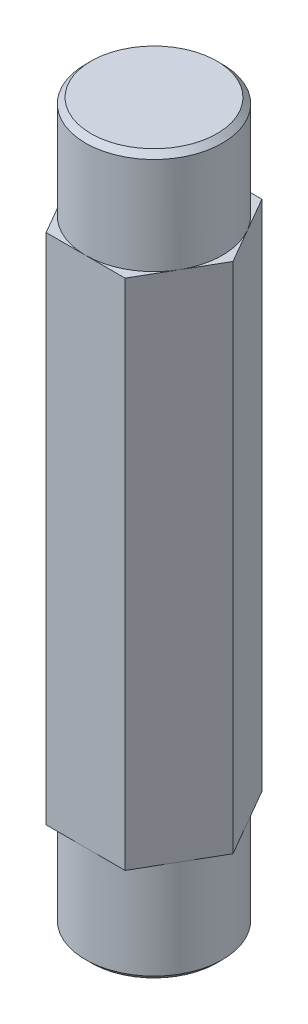
ISO-10303-21;
HEADER;
FILE_DESCRIPTION(('STEP AP214'),'2;1');
FILE_NAME('part.step','',(''),(''),'','','');
FILE_SCHEMA(('AUTOMOTIVE_DESIGN { 1 0 10303 214 1 1 1 1 }'));
ENDSEC;
DATA;
#1=APPLICATION_CONTEXT('core data for automotive mechanical design processes');
#2=APPLICATION_PROTOCOL_DEFINITION('international standard','automotive_design',2000,#1);
#3=PRODUCT_CONTEXT('',#1,'mechanical');
#4=PRODUCT('Part','Part','',(#3));
#5=PRODUCT_RELATED_PRODUCT_CATEGORY('part','',(#4));
#6=PRODUCT_DEFINITION_FORMATION('','',#4);
#7=PRODUCT_DEFINITION_CONTEXT('part definition',#1,'design');
#8=PRODUCT_DEFINITION('design','',#6,#7);
#9=PRODUCT_DEFINITION_SHAPE('','',#8);
#10=(LENGTH_UNIT() NAMED_UNIT(*) SI_UNIT(.MILLI.,.METRE.));
#11=(NAMED_UNIT(*) PLANE_ANGLE_UNIT() SI_UNIT($,.RADIAN.));
#12=(NAMED_UNIT(*) SI_UNIT($,.STERADIAN.) SOLID_ANGLE_UNIT());
#13=UNCERTAINTY_MEASURE_WITH_UNIT(LENGTH_MEASURE(1.E-05),#10,'distance_accuracy_value','');
#14=(GEOMETRIC_REPRESENTATION_CONTEXT(3) GLOBAL_UNCERTAINTY_ASSIGNED_CONTEXT((#13)) GLOBAL_UNIT_ASSIGNED_CONTEXT((#10,
#11,#12)) REPRESENTATION_CONTEXT('',''));
#15=CARTESIAN_POINT('',(0.,0.,0.));
#16=DIRECTION('',(0.,0.,1.));
#17=DIRECTION('',(1.,0.,0.));
#18=AXIS2_PLACEMENT_3D('',#15,#16,#17);
#19=CARTESIAN_POINT('',(0.,47.625,0.));
#20=DIRECTION('',(0.,1.,0.));
#21=DIRECTION('',(0.,0.,1.));
#22=AXIS2_PLACEMENT_3D('',#19,#20,#21);
#23=PLANE('',#22);
#24=CARTESIAN_POINT('',(0.,47.625,0.));
#25=DIRECTION('',(0.,1.,0.));
#26=DIRECTION('',(0.,0.,1.));
#27=AXIS2_PLACEMENT_3D('',#24,#25,#26);
#28=CIRCLE('',#27,6.35);
#29=CARTESIAN_POINT('',(0.,47.625,6.35));
#30=VERTEX_POINT('',#29);
#31=CARTESIAN_POINT('',(5.49926131403119,47.625,3.175));
#32=VERTEX_POINT('',#31);
#33=EDGE_CURVE('E146',#30,#32,#28,.T.);
#34=ORIENTED_EDGE('',*,*,#33,.F.);
#35=DIRECTION('',(1.,0.,0.));
#36=VECTOR('',#35,1.);
#37=CARTESIAN_POINT('',(-3.66617420935413,47.625,6.35));
#38=LINE('',#37,#36);
#39=CARTESIAN_POINT('',(3.66617420935412,47.625,6.35));
#40=VERTEX_POINT('',#39);
#41=EDGE_CURVE('E133',#30,#40,#38,.T.);
#42=ORIENTED_EDGE('',*,*,#41,.T.);
#43=DIRECTION('',(0.5,0.,-0.866025403784439));
#44=VECTOR('',#43,1.);
#45=CARTESIAN_POINT('',(3.66617420935412,47.625,6.35));
#46=LINE('',#45,#44);
#47=EDGE_CURVE('E147',#40,#32,#46,.T.);
#48=ORIENTED_EDGE('',*,*,#47,.T.);
#49=EDGE_LOOP('',(#34,#42,#48));
#50=FACE_BOUND('',#49,.T.);
#51=ADVANCED_FACE('F37',(#50),#23,.T.);
#52=CARTESIAN_POINT('',(5.49926131403119,47.625,-3.175));
#53=VERTEX_POINT('',#52);
#54=EDGE_CURVE('E152',#32,#53,#28,.T.);
#55=ORIENTED_EDGE('',*,*,#54,.F.);
#56=CARTESIAN_POINT('',(7.33234841870825,47.625,0.));
#57=VERTEX_POINT('',#56);
#58=EDGE_CURVE('E132',#32,#57,#46,.T.);
#59=ORIENTED_EDGE('',*,*,#58,.T.);
#60=DIRECTION('',(-0.5,0.,-0.866025403784439));
#61=VECTOR('',#60,1.);
#62=CARTESIAN_POINT('',(7.33234841870825,47.625,0.));
#63=LINE('',#62,#61);
#64=EDGE_CURVE('E166',#57,#53,#63,.T.);
#65=ORIENTED_EDGE('',*,*,#64,.T.);
#66=EDGE_LOOP('',(#55,#59,#65));
#67=FACE_BOUND('',#66,.T.);
#68=ADVANCED_FACE('F234',(#67),#23,.T.);
#69=CARTESIAN_POINT('',(0.,47.625,-6.35));
#70=VERTEX_POINT('',#69);
#71=EDGE_CURVE('E275',#53,#70,#28,.T.);
#72=ORIENTED_EDGE('',*,*,#71,.F.);
#73=CARTESIAN_POINT('',(3.66617420935413,47.625,-6.35));
#74=VERTEX_POINT('',#73);
#75=EDGE_CURVE('E165',#53,#74,#63,.T.);
#76=ORIENTED_EDGE('',*,*,#75,.T.);
#77=DIRECTION('',(-1.,0.,0.));
#78=VECTOR('',#77,1.);
#79=CARTESIAN_POINT('',(3.66617420935413,47.625,-6.35));
#80=LINE('',#79,#78);
#81=EDGE_CURVE('E170',#74,#70,#80,.T.);
#82=ORIENTED_EDGE('',*,*,#81,.T.);
#83=EDGE_LOOP('',(#72,#76,#82));
#84=FACE_BOUND('',#83,.T.);
#85=ADVANCED_FACE('F239',(#84),#23,.T.);
#86=CARTESIAN_POINT('',(-5.49926131403119,47.625,-3.175));
#87=VERTEX_POINT('',#86);
#88=EDGE_CURVE('E156',#70,#87,#28,.T.);
#89=ORIENTED_EDGE('',*,*,#88,.F.);
#90=CARTESIAN_POINT('',(-3.66617420935412,47.625,-6.35));
#91=VERTEX_POINT('',#90);
#92=EDGE_CURVE('E169',#70,#91,#80,.T.);
#93=ORIENTED_EDGE('',*,*,#92,.T.);
#94=DIRECTION('',(-0.5,0.,0.866025403784439));
#95=VECTOR('',#94,1.);
#96=CARTESIAN_POINT('',(-3.66617420935412,47.625,-6.35));
#97=LINE('',#96,#95);
#98=EDGE_CURVE('E174',#91,#87,#97,.T.);
#99=ORIENTED_EDGE('',*,*,#98,.T.);
#100=EDGE_LOOP('',(#89,#93,#99));
#101=FACE_BOUND('',#100,.T.);
#102=ADVANCED_FACE('F259',(#101),#23,.T.);
#103=CARTESIAN_POINT('',(-5.49926131403119,47.625,3.175));
#104=VERTEX_POINT('',#103);
#105=EDGE_CURVE('E60',#87,#104,#28,.T.);
#106=ORIENTED_EDGE('',*,*,#105,.F.);
#107=CARTESIAN_POINT('',(-7.33234841870825,47.625,0.));
#108=VERTEX_POINT('',#107);
#109=EDGE_CURVE('E173',#87,#108,#97,.T.);
#110=ORIENTED_EDGE('',*,*,#109,.T.);
#111=DIRECTION('',(0.5,0.,0.866025403784439));
#112=VECTOR('',#111,1.);
#113=CARTESIAN_POINT('',(-7.33234841870825,47.625,0.));
#114=LINE('',#113,#112);
#115=EDGE_CURVE('E177',#108,#104,#114,.T.);
#116=ORIENTED_EDGE('',*,*,#115,.T.);
#117=EDGE_LOOP('',(#106,#110,#116));
#118=FACE_BOUND('',#117,.T.);
#119=ADVANCED_FACE('F246',(#118),#23,.T.);
#120=CARTESIAN_POINT('',(0.,0.,0.));
#121=DIRECTION('',(0.,1.,0.));
#122=DIRECTION('',(0.,0.,1.));
#123=AXIS2_PLACEMENT_3D('',#120,#121,#122);
#124=PLANE('',#123);
#125=CARTESIAN_POINT('',(0.,0.,0.));
#126=DIRECTION('',(0.,-1.,0.));
#127=DIRECTION('',(0.,0.,-1.));
#128=AXIS2_PLACEMENT_3D('',#125,#126,#127);
#129=CIRCLE('',#128,6.35);
#130=CARTESIAN_POINT('',(0.,0.,-6.35));
#131=VERTEX_POINT('',#130);
#132=CARTESIAN_POINT('',(5.49926131403119,0.,-3.175));
#133=VERTEX_POINT('',#132);
#134=EDGE_CURVE('E150',#131,#133,#129,.T.);
#135=ORIENTED_EDGE('',*,*,#134,.F.);
#136=DIRECTION('',(-1.,0.,0.));
#137=VECTOR('',#136,1.);
#138=CARTESIAN_POINT('',(3.66617420935413,0.,-6.35));
#139=LINE('',#138,#137);
#140=CARTESIAN_POINT('',(3.66617420935413,0.,-6.35));
#141=VERTEX_POINT('',#140);
#142=EDGE_CURVE('E191',#141,#131,#139,.T.);
#143=ORIENTED_EDGE('',*,*,#142,.F.);
#144=DIRECTION('',(-0.5,0.,-0.866025403784439));
#145=VECTOR('',#144,1.);
#146=CARTESIAN_POINT('',(7.33234841870825,0.,0.));
#147=LINE('',#146,#145);
#148=EDGE_CURVE('E186',#133,#141,#147,.T.);
#149=ORIENTED_EDGE('',*,*,#148,.F.);
#150=EDGE_LOOP('',(#135,#143,#149));
#151=FACE_BOUND('',#150,.T.);
#152=ADVANCED_FACE('F253',(#151),#124,.F.);
#153=CARTESIAN_POINT('',(5.49926131403119,0.,3.175));
#154=VERTEX_POINT('',#153);
#155=EDGE_CURVE('E155',#133,#154,#129,.T.);
#156=ORIENTED_EDGE('',*,*,#155,.F.);
#157=CARTESIAN_POINT('',(7.33234841870825,0.,0.));
#158=VERTEX_POINT('',#157);
#159=EDGE_CURVE('E187',#158,#133,#147,.T.);
#160=ORIENTED_EDGE('',*,*,#159,.F.);
#161=DIRECTION('',(0.5,0.,-0.866025403784439));
#162=VECTOR('',#161,1.);
#163=CARTESIAN_POINT('',(3.66617420935412,0.,6.35));
#164=LINE('',#163,#162);
#165=EDGE_CURVE('E182',#154,#158,#164,.T.);
#166=ORIENTED_EDGE('',*,*,#165,.F.);
#167=EDGE_LOOP('',(#156,#160,#166));
#168=FACE_BOUND('',#167,.T.);
#169=ADVANCED_FACE('F264',(#168),#124,.F.);
#170=CARTESIAN_POINT('',(0.,0.,6.35));
#171=VERTEX_POINT('',#170);
#172=EDGE_CURVE('E158',#154,#171,#129,.T.);
#173=ORIENTED_EDGE('',*,*,#172,.F.);
#174=CARTESIAN_POINT('',(3.66617420935412,0.,6.35));
#175=VERTEX_POINT('',#174);
#176=EDGE_CURVE('E183',#175,#154,#164,.T.);
#177=ORIENTED_EDGE('',*,*,#176,.F.);
#178=DIRECTION('',(1.,0.,0.));
#179=VECTOR('',#178,1.);
#180=CARTESIAN_POINT('',(-3.66617420935413,0.,6.35));
#181=LINE('',#180,#179);
#182=EDGE_CURVE('E161',#171,#175,#181,.T.);
#183=ORIENTED_EDGE('',*,*,#182,.F.);
#184=EDGE_LOOP('',(#173,#177,#183));
#185=FACE_BOUND('',#184,.T.);
#186=ADVANCED_FACE('F306',(#185),#124,.F.);
#187=CARTESIAN_POINT('',(-5.49926131403119,0.,3.175));
#188=VERTEX_POINT('',#187);
#189=EDGE_CURVE('E301',#171,#188,#129,.T.);
#190=ORIENTED_EDGE('',*,*,#189,.F.);
#191=CARTESIAN_POINT('',(-3.66617420935413,0.,6.35));
#192=VERTEX_POINT('',#191);
#193=EDGE_CURVE('E180',#192,#171,#181,.T.);
#194=ORIENTED_EDGE('',*,*,#193,.F.);
#195=DIRECTION('',(0.5,0.,0.866025403784439));
#196=VECTOR('',#195,1.);
#197=CARTESIAN_POINT('',(-7.33234841870825,0.,0.));
#198=LINE('',#197,#196);
#199=EDGE_CURVE('E197',#188,#192,#198,.T.);
#200=ORIENTED_EDGE('',*,*,#199,.F.);
#201=EDGE_LOOP('',(#190,#194,#200));
#202=FACE_BOUND('',#201,.T.);
#203=ADVANCED_FACE('F312',(#202),#124,.F.);
#204=CARTESIAN_POINT('',(-5.49926131403119,0.,-3.175));
#205=VERTEX_POINT('',#204);
#206=EDGE_CURVE('E298',#188,#205,#129,.T.);
#207=ORIENTED_EDGE('',*,*,#206,.F.);
#208=CARTESIAN_POINT('',(-7.33234841870825,0.,0.));
#209=VERTEX_POINT('',#208);
#210=EDGE_CURVE('E144',#209,#188,#198,.T.);
#211=ORIENTED_EDGE('',*,*,#210,.F.);
#212=DIRECTION('',(-0.5,0.,0.866025403784439));
#213=VECTOR('',#212,1.);
#214=CARTESIAN_POINT('',(-3.66617420935412,0.,-6.35));
#215=LINE('',#214,#213);
#216=EDGE_CURVE('E193',#205,#209,#215,.T.);
#217=ORIENTED_EDGE('',*,*,#216,.F.);
#218=EDGE_LOOP('',(#207,#211,#217));
#219=FACE_BOUND('',#218,.T.);
#220=ADVANCED_FACE('F254',(#219),#124,.F.);
#221=CARTESIAN_POINT('',(-3.66617420935413,47.625,6.35));
#222=DIRECTION('',(0.,0.,-1.));
#223=DIRECTION('',(-1.,0.,0.));
#224=AXIS2_PLACEMENT_3D('',#221,#222,#223);
#225=PLANE('',#224);
#226=ORIENTED_EDGE('',*,*,#193,.T.);
#227=ORIENTED_EDGE('',*,*,#182,.T.);
#228=DIRECTION('',(0.,-1.,0.));
#229=VECTOR('',#228,1.);
#230=CARTESIAN_POINT('',(3.66617420935412,47.625,6.35));
#231=LINE('',#230,#229);
#232=EDGE_CURVE('E140',#40,#175,#231,.T.);
#233=ORIENTED_EDGE('',*,*,#232,.F.);
#234=ORIENTED_EDGE('',*,*,#41,.F.);
#235=CARTESIAN_POINT('',(-3.66617420935413,47.625,6.35));
#236=VERTEX_POINT('',#235);
#237=EDGE_CURVE('E125',#236,#30,#38,.T.);
#238=ORIENTED_EDGE('',*,*,#237,.F.);
#239=DIRECTION('',(0.,-1.,0.));
#240=VECTOR('',#239,1.);
#241=CARTESIAN_POINT('',(-3.66617420935413,47.625,6.35));
#242=LINE('',#241,#240);
#243=EDGE_CURVE('E179',#236,#192,#242,.T.);
#244=ORIENTED_EDGE('',*,*,#243,.T.);
#245=EDGE_LOOP('',(#226,#227,#233,#234,#238,#244));
#246=FACE_BOUND('',#245,.T.);
#247=ADVANCED_FACE('F138',(#246),#225,.F.);
#248=CARTESIAN_POINT('',(3.66617420935412,47.625,6.35));
#249=DIRECTION('',(-0.866025403784439,0.,-0.5));
#250=DIRECTION('',(-0.5,0.,0.866025403784439));
#251=AXIS2_PLACEMENT_3D('',#248,#249,#250);
#252=PLANE('',#251);
#253=ORIENTED_EDGE('',*,*,#176,.T.);
#254=ORIENTED_EDGE('',*,*,#165,.T.);
#255=DIRECTION('',(0.,-1.,0.));
#256=VECTOR('',#255,1.);
#257=CARTESIAN_POINT('',(7.33234841870825,47.625,0.));
#258=LINE('',#257,#256);
#259=EDGE_CURVE('E210',#57,#158,#258,.T.);
#260=ORIENTED_EDGE('',*,*,#259,.F.);
#261=ORIENTED_EDGE('',*,*,#58,.F.);
#262=ORIENTED_EDGE('',*,*,#47,.F.);
#263=ORIENTED_EDGE('',*,*,#232,.T.);
#264=EDGE_LOOP('',(#253,#254,#260,#261,#262,#263));
#265=FACE_BOUND('',#264,.T.);
#266=ADVANCED_FACE('F285',(#265),#252,.F.);
#267=CARTESIAN_POINT('',(7.33234841870825,47.625,0.));
#268=DIRECTION('',(-0.866025403784439,0.,0.5));
#269=DIRECTION('',(0.5,0.,0.866025403784439));
#270=AXIS2_PLACEMENT_3D('',#267,#268,#269);
#271=PLANE('',#270);
#272=ORIENTED_EDGE('',*,*,#159,.T.);
#273=ORIENTED_EDGE('',*,*,#148,.T.);
#274=DIRECTION('',(0.,-1.,0.));
#275=VECTOR('',#274,1.);
#276=CARTESIAN_POINT('',(3.66617420935413,47.625,-6.35));
#277=LINE('',#276,#275);
#278=EDGE_CURVE('E207',#74,#141,#277,.T.);
#279=ORIENTED_EDGE('',*,*,#278,.F.);
#280=ORIENTED_EDGE('',*,*,#75,.F.);
#281=ORIENTED_EDGE('',*,*,#64,.F.);
#282=ORIENTED_EDGE('',*,*,#259,.T.);
#283=EDGE_LOOP('',(#272,#273,#279,#280,#281,#282));
#284=FACE_BOUND('',#283,.T.);
#285=ADVANCED_FACE('F289',(#284),#271,.F.);
#286=CARTESIAN_POINT('',(3.66617420935413,47.625,-6.35));
#287=DIRECTION('',(0.,0.,1.));
#288=DIRECTION('',(1.,0.,0.));
#289=AXIS2_PLACEMENT_3D('',#286,#287,#288);
#290=PLANE('',#289);
#291=ORIENTED_EDGE('',*,*,#142,.T.);
#292=CARTESIAN_POINT('',(-3.66617420935412,0.,-6.35));
#293=VERTEX_POINT('',#292);
#294=EDGE_CURVE('E190',#131,#293,#139,.T.);
#295=ORIENTED_EDGE('',*,*,#294,.T.);
#296=DIRECTION('',(0.,-1.,0.));
#297=VECTOR('',#296,1.);
#298=CARTESIAN_POINT('',(-3.66617420935412,47.625,-6.35));
#299=LINE('',#298,#297);
#300=EDGE_CURVE('E204',#91,#293,#299,.T.);
#301=ORIENTED_EDGE('',*,*,#300,.F.);
#302=ORIENTED_EDGE('',*,*,#92,.F.);
#303=ORIENTED_EDGE('',*,*,#81,.F.);
#304=ORIENTED_EDGE('',*,*,#278,.T.);
#305=EDGE_LOOP('',(#291,#295,#301,#302,#303,#304));
#306=FACE_BOUND('',#305,.T.);
#307=ADVANCED_FACE('F278',(#306),#290,.F.);
#308=CARTESIAN_POINT('',(-3.66617420935412,47.625,-6.35));
#309=DIRECTION('',(0.866025403784439,0.,0.5));
#310=DIRECTION('',(0.5,0.,-0.866025403784439));
#311=AXIS2_PLACEMENT_3D('',#308,#309,#310);
#312=PLANE('',#311);
#313=EDGE_CURVE('E194',#293,#205,#215,.T.);
#314=ORIENTED_EDGE('',*,*,#313,.T.);
#315=ORIENTED_EDGE('',*,*,#216,.T.);
#316=DIRECTION('',(0.,-1.,0.));
#317=VECTOR('',#316,1.);
#318=CARTESIAN_POINT('',(-7.33234841870825,47.625,0.));
#319=LINE('',#318,#317);
#320=EDGE_CURVE('E201',#108,#209,#319,.T.);
#321=ORIENTED_EDGE('',*,*,#320,.F.);
#322=ORIENTED_EDGE('',*,*,#109,.F.);
#323=ORIENTED_EDGE('',*,*,#98,.F.);
#324=ORIENTED_EDGE('',*,*,#300,.T.);
#325=EDGE_LOOP('',(#314,#315,#321,#322,#323,#324));
#326=FACE_BOUND('',#325,.T.);
#327=ADVANCED_FACE('F255',(#326),#312,.F.);
#328=CARTESIAN_POINT('',(-7.33234841870825,47.625,0.));
#329=DIRECTION('',(0.866025403784439,0.,-0.5));
#330=DIRECTION('',(-0.5,0.,-0.866025403784439));
#331=AXIS2_PLACEMENT_3D('',#328,#329,#330);
#332=PLANE('',#331);
#333=ORIENTED_EDGE('',*,*,#210,.T.);
#334=ORIENTED_EDGE('',*,*,#199,.T.);
#335=ORIENTED_EDGE('',*,*,#243,.F.);
#336=EDGE_CURVE('E128',#104,#236,#114,.T.);
#337=ORIENTED_EDGE('',*,*,#336,.F.);
#338=ORIENTED_EDGE('',*,*,#115,.F.);
#339=ORIENTED_EDGE('',*,*,#320,.T.);
#340=EDGE_LOOP('',(#333,#334,#335,#337,#338,#339));
#341=FACE_BOUND('',#340,.T.);
#342=ADVANCED_FACE('F245',(#341),#332,.F.);
#343=EDGE_CURVE('E52',#104,#30,#28,.T.);
#344=ORIENTED_EDGE('',*,*,#343,.F.);
#345=ORIENTED_EDGE('',*,*,#336,.T.);
#346=ORIENTED_EDGE('',*,*,#237,.T.);
#347=EDGE_LOOP('',(#344,#345,#346));
#348=FACE_BOUND('',#347,.T.);
#349=ADVANCED_FACE('F127',(#348),#23,.T.);
#350=EDGE_CURVE('E162',#205,#131,#129,.T.);
#351=ORIENTED_EDGE('',*,*,#350,.F.);
#352=ORIENTED_EDGE('',*,*,#313,.F.);
#353=ORIENTED_EDGE('',*,*,#294,.F.);
#354=EDGE_LOOP('',(#351,#352,#353));
#355=FACE_BOUND('',#354,.T.);
#356=ADVANCED_FACE('F244',(#355),#124,.F.);
#357=CARTESIAN_POINT('',(0.,-9.525,0.));
#358=DIRECTION('',(0.,1.,0.));
#359=DIRECTION('',(0.,0.,1.));
#360=AXIS2_PLACEMENT_3D('',#357,#358,#359);
#361=CYLINDRICAL_SURFACE('',#360,6.35);
#362=CARTESIAN_POINT('',(0.,-9.01700000000006,0.));
#363=DIRECTION('',(0.,-1.,0.));
#364=DIRECTION('',(0.,0.,-1.));
#365=AXIS2_PLACEMENT_3D('',#362,#363,#364);
#366=CIRCLE('',#365,6.35);
#367=CARTESIAN_POINT('',(0.,-9.01700000000006,-6.35));
#368=VERTEX_POINT('',#367);
#369=EDGE_CURVE('E11',#368,#368,#366,.F.);
#370=ORIENTED_EDGE('',*,*,#369,.T.);
#371=EDGE_LOOP('',(#370));
#372=FACE_BOUND('',#371,.T.);
#373=ORIENTED_EDGE('',*,*,#134,.T.);
#374=ORIENTED_EDGE('',*,*,#155,.T.);
#375=ORIENTED_EDGE('',*,*,#172,.T.);
#376=ORIENTED_EDGE('',*,*,#189,.T.);
#377=ORIENTED_EDGE('',*,*,#206,.T.);
#378=ORIENTED_EDGE('',*,*,#350,.T.);
#379=EDGE_LOOP('',(#373,#374,#375,#376,#377,#378));
#380=FACE_BOUND('',#379,.T.);
#381=ADVANCED_FACE('F251',(#372,#380),#361,.T.);
#382=CARTESIAN_POINT('',(0.,-9.525,0.));
#383=DIRECTION('',(0.,-1.,0.));
#384=DIRECTION('',(0.,0.,-1.));
#385=AXIS2_PLACEMENT_3D('',#382,#383,#384);
#386=PLANE('',#385);
#387=CARTESIAN_POINT('',(0.,-9.525,0.));
#388=DIRECTION('',(0.,-1.,0.));
#389=DIRECTION('',(0.,0.,-1.));
#390=AXIS2_PLACEMENT_3D('',#387,#388,#389);
#391=CIRCLE('',#390,5.84200000000005);
#392=CARTESIAN_POINT('',(0.,-9.525,-5.84200000000005));
#393=VERTEX_POINT('',#392);
#394=EDGE_CURVE('E45',#393,#393,#391,.T.);
#395=ORIENTED_EDGE('',*,*,#394,.T.);
#396=EDGE_LOOP('',(#395));
#397=FACE_BOUND('',#396,.T.);
#398=ADVANCED_FACE('F222',(#397),#386,.T.);
#399=CARTESIAN_POINT('',(0.,57.15,0.));
#400=DIRECTION('',(0.,-1.,0.));
#401=DIRECTION('',(0.,0.,-1.));
#402=AXIS2_PLACEMENT_3D('',#399,#400,#401);
#403=CYLINDRICAL_SURFACE('',#402,6.35);
#404=CARTESIAN_POINT('',(0.,56.642,0.));
#405=DIRECTION('',(0.,1.,0.));
#406=DIRECTION('',(0.,0.,1.));
#407=AXIS2_PLACEMENT_3D('',#404,#405,#406);
#408=CIRCLE('',#407,6.35);
#409=CARTESIAN_POINT('',(0.,56.642,6.35));
#410=VERTEX_POINT('',#409);
#411=EDGE_CURVE('E217',#410,#410,#408,.F.);
#412=ORIENTED_EDGE('',*,*,#411,.T.);
#413=EDGE_LOOP('',(#412));
#414=FACE_BOUND('',#413,.T.);
#415=ORIENTED_EDGE('',*,*,#33,.T.);
#416=ORIENTED_EDGE('',*,*,#54,.T.);
#417=ORIENTED_EDGE('',*,*,#71,.T.);
#418=ORIENTED_EDGE('',*,*,#88,.T.);
#419=ORIENTED_EDGE('',*,*,#105,.T.);
#420=ORIENTED_EDGE('',*,*,#343,.T.);
#421=EDGE_LOOP('',(#415,#416,#417,#418,#419,#420));
#422=FACE_BOUND('',#421,.T.);
#423=ADVANCED_FACE('F153',(#414,#422),#403,.T.);
#424=CARTESIAN_POINT('',(0.,57.15,0.));
#425=DIRECTION('',(0.,1.,0.));
#426=DIRECTION('',(0.,0.,1.));
#427=AXIS2_PLACEMENT_3D('',#424,#425,#426);
#428=PLANE('',#427);
#429=CARTESIAN_POINT('',(0.,57.15,0.));
#430=DIRECTION('',(0.,1.,0.));
#431=DIRECTION('',(0.,0.,1.));
#432=AXIS2_PLACEMENT_3D('',#429,#430,#431);
#433=CIRCLE('',#432,5.84200000000004);
#434=CARTESIAN_POINT('',(0.,57.15,5.84200000000004));
#435=VERTEX_POINT('',#434);
#436=EDGE_CURVE('E214',#435,#435,#433,.T.);
#437=ORIENTED_EDGE('',*,*,#436,.T.);
#438=EDGE_LOOP('',(#437));
#439=FACE_BOUND('',#438,.T.);
#440=ADVANCED_FACE('F230',(#439),#428,.T.);
#441=CARTESIAN_POINT('',(0.,57.15,0.));
#442=DIRECTION('',(0.,-1.,0.));
#443=DIRECTION('',(0.,0.,-1.));
#444=AXIS2_PLACEMENT_3D('',#441,#442,#443);
#445=CONICAL_SURFACE('',#444,5.84200000000004,0.785398163397436);
#446=ORIENTED_EDGE('',*,*,#411,.F.);
#447=EDGE_LOOP('',(#446));
#448=FACE_BOUND('',#447,.T.);
#449=ORIENTED_EDGE('',*,*,#436,.F.);
#450=EDGE_LOOP('',(#449));
#451=FACE_BOUND('',#450,.T.);
#452=ADVANCED_FACE('F225',(#448,#451),#445,.T.);
#453=CARTESIAN_POINT('',(0.,-9.525,0.));
#454=DIRECTION('',(0.,1.,0.));
#455=DIRECTION('',(0.,0.,1.));
#456=AXIS2_PLACEMENT_3D('',#453,#454,#455);
#457=CONICAL_SURFACE('',#456,5.84200000000005,0.785398163397454);
#458=ORIENTED_EDGE('',*,*,#369,.F.);
#459=EDGE_LOOP('',(#458));
#460=FACE_BOUND('',#459,.T.);
#461=ORIENTED_EDGE('',*,*,#394,.F.);
#462=EDGE_LOOP('',(#461));
#463=FACE_BOUND('',#462,.T.);
#464=ADVANCED_FACE('F39',(#460,#463),#457,.T.);
#465=CLOSED_SHELL('',(#51,#68,#85,#102,#119,#152,#169,#186,#203,#220,#247,#266,#285,#307,#327,
#342,#349,#356,#381,#398,#423,#440,#452,#464));
#466=MANIFOLD_SOLID_BREP('B2',#465);
#467=ADVANCED_BREP_SHAPE_REPRESENTATION('',(#18,#466),#14);
#468=SHAPE_DEFINITION_REPRESENTATION(#9,#467);
ENDSEC;
END-ISO-10303-21;
